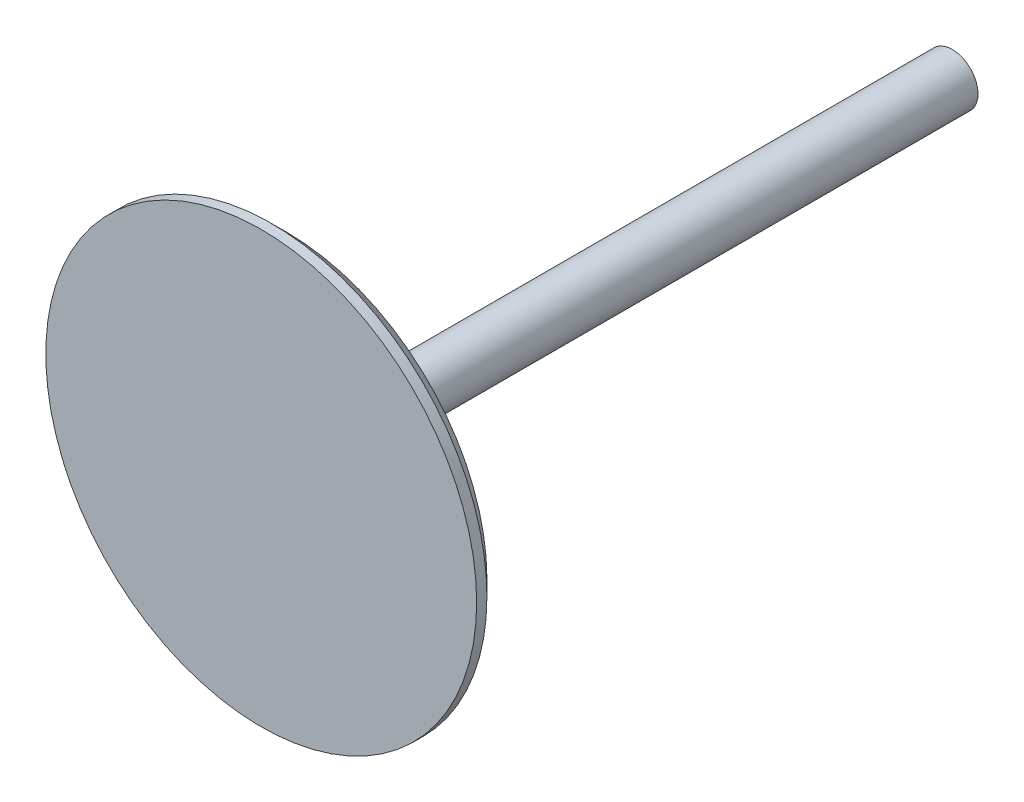
ISO-10303-21;
HEADER;
FILE_DESCRIPTION(('STEP AP214'),'2;1');
FILE_NAME('part.step','',(''),(''),'','','');
FILE_SCHEMA(('AUTOMOTIVE_DESIGN { 1 0 10303 214 1 1 1 1 }'));
ENDSEC;
DATA;
#1=APPLICATION_CONTEXT('core data for automotive mechanical design processes');
#2=APPLICATION_PROTOCOL_DEFINITION('international standard','automotive_design',2000,#1);
#3=PRODUCT_CONTEXT('',#1,'mechanical');
#4=PRODUCT('Part','Part','',(#3));
#5=PRODUCT_RELATED_PRODUCT_CATEGORY('part','',(#4));
#6=PRODUCT_DEFINITION_FORMATION('','',#4);
#7=PRODUCT_DEFINITION_CONTEXT('part definition',#1,'design');
#8=PRODUCT_DEFINITION('design','',#6,#7);
#9=PRODUCT_DEFINITION_SHAPE('','',#8);
#10=(LENGTH_UNIT() NAMED_UNIT(*) SI_UNIT(.MILLI.,.METRE.));
#11=(NAMED_UNIT(*) PLANE_ANGLE_UNIT() SI_UNIT($,.RADIAN.));
#12=(NAMED_UNIT(*) SI_UNIT($,.STERADIAN.) SOLID_ANGLE_UNIT());
#13=UNCERTAINTY_MEASURE_WITH_UNIT(LENGTH_MEASURE(1.E-05),#10,'distance_accuracy_value','');
#14=(GEOMETRIC_REPRESENTATION_CONTEXT(3) GLOBAL_UNCERTAINTY_ASSIGNED_CONTEXT((#13)) GLOBAL_UNIT_ASSIGNED_CONTEXT((#10,
#11,#12)) REPRESENTATION_CONTEXT('',''));
#15=CARTESIAN_POINT('',(0.,0.,0.));
#16=DIRECTION('',(0.,0.,1.));
#17=DIRECTION('',(1.,0.,0.));
#18=AXIS2_PLACEMENT_3D('',#15,#16,#17);
#19=CARTESIAN_POINT('',(26.67,0.,0.));
#20=DIRECTION('',(0.,0.,1.));
#21=DIRECTION('',(1.,0.,0.));
#22=AXIS2_PLACEMENT_3D('',#19,#20,#21);
#23=PLANE('',#22);
#24=CARTESIAN_POINT('',(0.,0.,0.));
#25=DIRECTION('',(0.,0.,1.));
#26=DIRECTION('',(1.,0.,0.));
#27=AXIS2_PLACEMENT_3D('',#24,#25,#26);
#28=CIRCLE('',#27,26.67);
#29=CARTESIAN_POINT('',(26.67,0.,0.));
#30=VERTEX_POINT('',#29);
#31=EDGE_CURVE('E10',#30,#30,#28,.T.);
#32=ORIENTED_EDGE('',*,*,#31,.T.);
#33=EDGE_LOOP('',(#32));
#34=FACE_BOUND('',#33,.T.);
#35=ADVANCED_FACE('F35',(#34),#23,.T.);
#36=CARTESIAN_POINT('',(0.,0.,0.));
#37=DIRECTION('',(0.,0.,1.));
#38=DIRECTION('',(1.,0.,0.));
#39=AXIS2_PLACEMENT_3D('',#36,#37,#38);
#40=CYLINDRICAL_SURFACE('',#39,26.67);
#41=CARTESIAN_POINT('',(0.,0.,-1.27));
#42=DIRECTION('',(0.,0.,1.));
#43=DIRECTION('',(1.,0.,0.));
#44=AXIS2_PLACEMENT_3D('',#41,#42,#43);
#45=CIRCLE('',#44,26.67);
#46=CARTESIAN_POINT('',(26.67,0.,-1.27));
#47=VERTEX_POINT('',#46);
#48=EDGE_CURVE('E41',#47,#47,#45,.T.);
#49=ORIENTED_EDGE('',*,*,#48,.T.);
#50=EDGE_LOOP('',(#49));
#51=FACE_BOUND('',#50,.T.);
#52=ORIENTED_EDGE('',*,*,#31,.F.);
#53=EDGE_LOOP('',(#52));
#54=FACE_BOUND('',#53,.T.);
#55=ADVANCED_FACE('F70',(#51,#54),#40,.T.);
#56=CARTESIAN_POINT('',(0.,0.,-1.27));
#57=DIRECTION('',(0.,0.,1.));
#58=DIRECTION('',(1.,0.,0.));
#59=AXIS2_PLACEMENT_3D('',#56,#57,#58);
#60=CONICAL_SURFACE('',#59,26.67,0.785398163397452);
#61=CARTESIAN_POINT('',(0.,0.,-3.18));
#62=DIRECTION('',(0.,0.,1.));
#63=DIRECTION('',(1.,0.,0.));
#64=AXIS2_PLACEMENT_3D('',#61,#62,#63);
#65=CIRCLE('',#64,24.76);
#66=CARTESIAN_POINT('',(24.76,0.,-3.18));
#67=VERTEX_POINT('',#66);
#68=EDGE_CURVE('E45',#67,#67,#65,.T.);
#69=ORIENTED_EDGE('',*,*,#68,.T.);
#70=EDGE_LOOP('',(#69));
#71=FACE_BOUND('',#70,.T.);
#72=ORIENTED_EDGE('',*,*,#48,.F.);
#73=EDGE_LOOP('',(#72));
#74=FACE_BOUND('',#73,.T.);
#75=ADVANCED_FACE('F74',(#71,#74),#60,.T.);
#76=CARTESIAN_POINT('',(0.,0.,-17.0542062836041));
#77=DIRECTION('',(0.,0.,1.));
#78=DIRECTION('',(1.,0.,0.));
#79=AXIS2_PLACEMENT_3D('',#76,#77,#78);
#80=TOROIDAL_SURFACE('',#79,18.43,15.25);
#81=CARTESIAN_POINT('',(0.,0.,-17.0542062836041));
#82=DIRECTION('',(0.,0.,1.));
#83=DIRECTION('',(1.,0.,0.));
#84=AXIS2_PLACEMENT_3D('',#81,#82,#83);
#85=CIRCLE('',#84,3.18000000000001);
#86=CARTESIAN_POINT('',(3.18000000000001,0.,-17.0542062836041));
#87=VERTEX_POINT('',#86);
#88=EDGE_CURVE('E49',#87,#87,#85,.T.);
#89=ORIENTED_EDGE('',*,*,#88,.T.);
#90=EDGE_LOOP('',(#89));
#91=FACE_BOUND('',#90,.T.);
#92=ORIENTED_EDGE('',*,*,#68,.F.);
#93=EDGE_LOOP('',(#92));
#94=FACE_BOUND('',#93,.T.);
#95=ADVANCED_FACE('F67',(#91,#94),#80,.F.);
#96=CARTESIAN_POINT('',(0.,0.,0.));
#97=DIRECTION('',(0.,0.,1.));
#98=DIRECTION('',(1.,0.,0.));
#99=AXIS2_PLACEMENT_3D('',#96,#97,#98);
#100=CYLINDRICAL_SURFACE('',#99,3.18000000000001);
#101=CARTESIAN_POINT('',(0.,0.,-85.55));
#102=DIRECTION('',(0.,0.,1.));
#103=DIRECTION('',(1.,0.,0.));
#104=AXIS2_PLACEMENT_3D('',#101,#102,#103);
#105=CIRCLE('',#104,3.18);
#106=CARTESIAN_POINT('',(3.18,0.,-85.55));
#107=VERTEX_POINT('',#106);
#108=EDGE_CURVE('E54',#107,#107,#105,.T.);
#109=ORIENTED_EDGE('',*,*,#108,.T.);
#110=EDGE_LOOP('',(#109));
#111=FACE_BOUND('',#110,.T.);
#112=ORIENTED_EDGE('',*,*,#88,.F.);
#113=EDGE_LOOP('',(#112));
#114=FACE_BOUND('',#113,.T.);
#115=ADVANCED_FACE('F58',(#111,#114),#100,.T.);
#116=CARTESIAN_POINT('',(0.,0.,-85.55));
#117=DIRECTION('',(0.,0.,-1.));
#118=DIRECTION('',(-1.,0.,0.));
#119=AXIS2_PLACEMENT_3D('',#116,#117,#118);
#120=PLANE('',#119);
#121=ORIENTED_EDGE('',*,*,#108,.F.);
#122=EDGE_LOOP('',(#121));
#123=FACE_BOUND('',#122,.T.);
#124=ADVANCED_FACE('F61',(#123),#120,.T.);
#125=CLOSED_SHELL('',(#35,#55,#75,#95,#115,#124));
#126=MANIFOLD_SOLID_BREP('B2',#125);
#127=ADVANCED_BREP_SHAPE_REPRESENTATION('',(#18,#126),#14);
#128=SHAPE_DEFINITION_REPRESENTATION(#9,#127);
ENDSEC;
END-ISO-10303-21;
